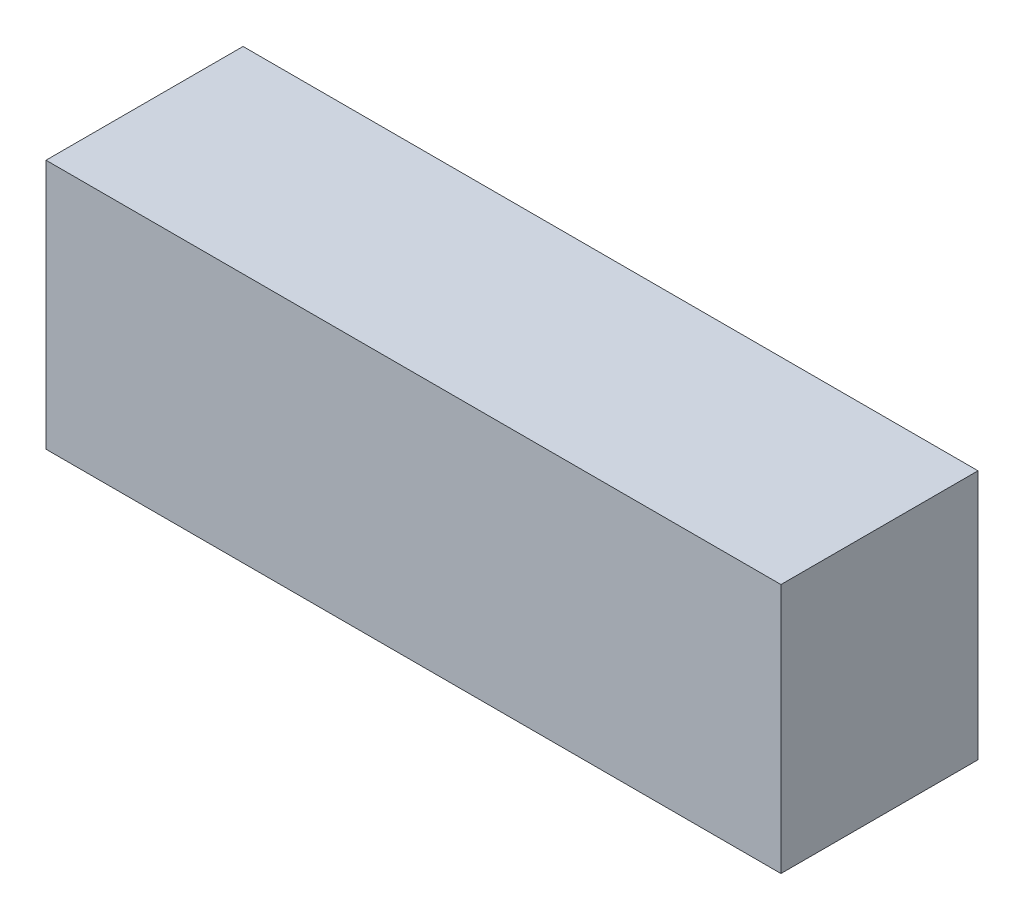
ISO-10303-21;
HEADER;
FILE_DESCRIPTION(('STEP AP214'),'2;1');
FILE_NAME('part.step','',(''),(''),'','','');
FILE_SCHEMA(('AUTOMOTIVE_DESIGN { 1 0 10303 214 1 1 1 1 }'));
ENDSEC;
DATA;
#1=APPLICATION_CONTEXT('core data for automotive mechanical design processes');
#2=APPLICATION_PROTOCOL_DEFINITION('international standard','automotive_design',2000,#1);
#3=PRODUCT_CONTEXT('',#1,'mechanical');
#4=PRODUCT('Part','Part','',(#3));
#5=PRODUCT_RELATED_PRODUCT_CATEGORY('part','',(#4));
#6=PRODUCT_DEFINITION_FORMATION('','',#4);
#7=PRODUCT_DEFINITION_CONTEXT('part definition',#1,'design');
#8=PRODUCT_DEFINITION('design','',#6,#7);
#9=PRODUCT_DEFINITION_SHAPE('','',#8);
#10=(LENGTH_UNIT() NAMED_UNIT(*) SI_UNIT(.MILLI.,.METRE.));
#11=(NAMED_UNIT(*) PLANE_ANGLE_UNIT() SI_UNIT($,.RADIAN.));
#12=(NAMED_UNIT(*) SI_UNIT($,.STERADIAN.) SOLID_ANGLE_UNIT());
#13=UNCERTAINTY_MEASURE_WITH_UNIT(LENGTH_MEASURE(1.E-05),#10,'distance_accuracy_value','');
#14=(GEOMETRIC_REPRESENTATION_CONTEXT(3) GLOBAL_UNCERTAINTY_ASSIGNED_CONTEXT((#13)) GLOBAL_UNIT_ASSIGNED_CONTEXT((#10,
#11,#12)) REPRESENTATION_CONTEXT('',''));
#15=CARTESIAN_POINT('',(0.,0.,0.));
#16=DIRECTION('',(0.,0.,1.));
#17=DIRECTION('',(1.,0.,0.));
#18=AXIS2_PLACEMENT_3D('',#15,#16,#17);
#19=CARTESIAN_POINT('',(0.,0.,37.));
#20=DIRECTION('',(1.,0.,0.));
#21=DIRECTION('',(0.,0.,-1.));
#22=AXIS2_PLACEMENT_3D('',#19,#20,#21);
#23=PLANE('',#22);
#24=DIRECTION('',(0.,-1.,0.));
#25=VECTOR('',#24,1.);
#26=CARTESIAN_POINT('',(0.,0.,0.));
#27=LINE('',#26,#25);
#28=CARTESIAN_POINT('',(0.,47.,0.));
#29=VERTEX_POINT('',#28);
#30=CARTESIAN_POINT('',(0.,0.,0.));
#31=VERTEX_POINT('',#30);
#32=EDGE_CURVE('E97',#29,#31,#27,.T.);
#33=ORIENTED_EDGE('',*,*,#32,.T.);
#34=DIRECTION('',(0.,0.,-1.));
#35=VECTOR('',#34,1.);
#36=CARTESIAN_POINT('',(0.,0.,37.));
#37=LINE('',#36,#35);
#38=CARTESIAN_POINT('',(0.,0.,37.));
#39=VERTEX_POINT('',#38);
#40=EDGE_CURVE('E11',#39,#31,#37,.T.);
#41=ORIENTED_EDGE('',*,*,#40,.F.);
#42=DIRECTION('',(0.,-1.,0.));
#43=VECTOR('',#42,1.);
#44=CARTESIAN_POINT('',(0.,0.,37.));
#45=LINE('',#44,#43);
#46=CARTESIAN_POINT('',(0.,47.,37.));
#47=VERTEX_POINT('',#46);
#48=EDGE_CURVE('E85',#47,#39,#45,.T.);
#49=ORIENTED_EDGE('',*,*,#48,.F.);
#50=DIRECTION('',(0.,0.,-1.));
#51=VECTOR('',#50,1.);
#52=CARTESIAN_POINT('',(0.,47.,37.));
#53=LINE('',#52,#51);
#54=EDGE_CURVE('E93',#47,#29,#53,.T.);
#55=ORIENTED_EDGE('',*,*,#54,.T.);
#56=EDGE_LOOP('',(#33,#41,#49,#55));
#57=FACE_BOUND('',#56,.T.);
#58=ADVANCED_FACE('F34',(#57),#23,.F.);
#59=CARTESIAN_POINT('',(0.,0.,37.));
#60=DIRECTION('',(0.,1.,0.));
#61=DIRECTION('',(0.,0.,1.));
#62=AXIS2_PLACEMENT_3D('',#59,#60,#61);
#63=PLANE('',#62);
#64=DIRECTION('',(1.,0.,0.));
#65=VECTOR('',#64,1.);
#66=CARTESIAN_POINT('',(0.,0.,0.));
#67=LINE('',#66,#65);
#68=CARTESIAN_POINT('',(138.,0.,0.));
#69=VERTEX_POINT('',#68);
#70=EDGE_CURVE('E89',#31,#69,#67,.T.);
#71=ORIENTED_EDGE('',*,*,#70,.T.);
#72=DIRECTION('',(0.,0.,-1.));
#73=VECTOR('',#72,1.);
#74=CARTESIAN_POINT('',(138.,0.,37.));
#75=LINE('',#74,#73);
#76=CARTESIAN_POINT('',(138.,0.,37.));
#77=VERTEX_POINT('',#76);
#78=EDGE_CURVE('E42',#77,#69,#75,.T.);
#79=ORIENTED_EDGE('',*,*,#78,.F.);
#80=DIRECTION('',(1.,0.,0.));
#81=VECTOR('',#80,1.);
#82=CARTESIAN_POINT('',(0.,0.,37.));
#83=LINE('',#82,#81);
#84=EDGE_CURVE('E80',#39,#77,#83,.T.);
#85=ORIENTED_EDGE('',*,*,#84,.F.);
#86=ORIENTED_EDGE('',*,*,#40,.T.);
#87=EDGE_LOOP('',(#71,#79,#85,#86));
#88=FACE_BOUND('',#87,.T.);
#89=ADVANCED_FACE('F88',(#88),#63,.F.);
#90=CARTESIAN_POINT('',(138.,0.,37.));
#91=DIRECTION('',(-1.,0.,0.));
#92=DIRECTION('',(0.,0.,1.));
#93=AXIS2_PLACEMENT_3D('',#90,#91,#92);
#94=PLANE('',#93);
#95=DIRECTION('',(0.,1.,0.));
#96=VECTOR('',#95,1.);
#97=CARTESIAN_POINT('',(138.,0.,0.));
#98=LINE('',#97,#96);
#99=CARTESIAN_POINT('',(138.,47.,0.));
#100=VERTEX_POINT('',#99);
#101=EDGE_CURVE('E67',#69,#100,#98,.T.);
#102=ORIENTED_EDGE('',*,*,#101,.T.);
#103=DIRECTION('',(0.,0.,-1.));
#104=VECTOR('',#103,1.);
#105=CARTESIAN_POINT('',(138.,47.,37.));
#106=LINE('',#105,#104);
#107=CARTESIAN_POINT('',(138.,47.,37.));
#108=VERTEX_POINT('',#107);
#109=EDGE_CURVE('E90',#108,#100,#106,.T.);
#110=ORIENTED_EDGE('',*,*,#109,.F.);
#111=DIRECTION('',(0.,1.,0.));
#112=VECTOR('',#111,1.);
#113=CARTESIAN_POINT('',(138.,0.,37.));
#114=LINE('',#113,#112);
#115=EDGE_CURVE('E83',#77,#108,#114,.T.);
#116=ORIENTED_EDGE('',*,*,#115,.F.);
#117=ORIENTED_EDGE('',*,*,#78,.T.);
#118=EDGE_LOOP('',(#102,#110,#116,#117));
#119=FACE_BOUND('',#118,.T.);
#120=ADVANCED_FACE('F91',(#119),#94,.F.);
#121=CARTESIAN_POINT('',(0.,47.,37.));
#122=DIRECTION('',(0.,-1.,0.));
#123=DIRECTION('',(0.,0.,-1.));
#124=AXIS2_PLACEMENT_3D('',#121,#122,#123);
#125=PLANE('',#124);
#126=DIRECTION('',(-1.,0.,0.));
#127=VECTOR('',#126,1.);
#128=CARTESIAN_POINT('',(0.,47.,0.));
#129=LINE('',#128,#127);
#130=EDGE_CURVE('E73',#100,#29,#129,.T.);
#131=ORIENTED_EDGE('',*,*,#130,.T.);
#132=ORIENTED_EDGE('',*,*,#54,.F.);
#133=DIRECTION('',(-1.,0.,0.));
#134=VECTOR('',#133,1.);
#135=CARTESIAN_POINT('',(0.,47.,37.));
#136=LINE('',#135,#134);
#137=EDGE_CURVE('E50',#108,#47,#136,.T.);
#138=ORIENTED_EDGE('',*,*,#137,.F.);
#139=ORIENTED_EDGE('',*,*,#109,.T.);
#140=EDGE_LOOP('',(#131,#132,#138,#139));
#141=FACE_BOUND('',#140,.T.);
#142=ADVANCED_FACE('F104',(#141),#125,.F.);
#143=CARTESIAN_POINT('',(0.,0.,37.));
#144=DIRECTION('',(0.,0.,-1.));
#145=DIRECTION('',(-1.,0.,0.));
#146=AXIS2_PLACEMENT_3D('',#143,#144,#145);
#147=PLANE('',#146);
#148=ORIENTED_EDGE('',*,*,#48,.T.);
#149=ORIENTED_EDGE('',*,*,#84,.T.);
#150=ORIENTED_EDGE('',*,*,#115,.T.);
#151=ORIENTED_EDGE('',*,*,#137,.T.);
#152=EDGE_LOOP('',(#148,#149,#150,#151));
#153=FACE_BOUND('',#152,.T.);
#154=ADVANCED_FACE('F81',(#153),#147,.F.);
#155=CARTESIAN_POINT('',(0.,0.,0.));
#156=DIRECTION('',(0.,0.,-1.));
#157=DIRECTION('',(-1.,0.,0.));
#158=AXIS2_PLACEMENT_3D('',#155,#156,#157);
#159=PLANE('',#158);
#160=ORIENTED_EDGE('',*,*,#32,.F.);
#161=ORIENTED_EDGE('',*,*,#130,.F.);
#162=ORIENTED_EDGE('',*,*,#101,.F.);
#163=ORIENTED_EDGE('',*,*,#70,.F.);
#164=EDGE_LOOP('',(#160,#161,#162,#163));
#165=FACE_BOUND('',#164,.T.);
#166=ADVANCED_FACE('F107',(#165),#159,.T.);
#167=CLOSED_SHELL('',(#58,#89,#120,#142,#154,#166));
#168=MANIFOLD_SOLID_BREP('B2',#167);
#169=ADVANCED_BREP_SHAPE_REPRESENTATION('',(#18,#168),#14);
#170=SHAPE_DEFINITION_REPRESENTATION(#9,#169);
ENDSEC;
END-ISO-10303-21;
